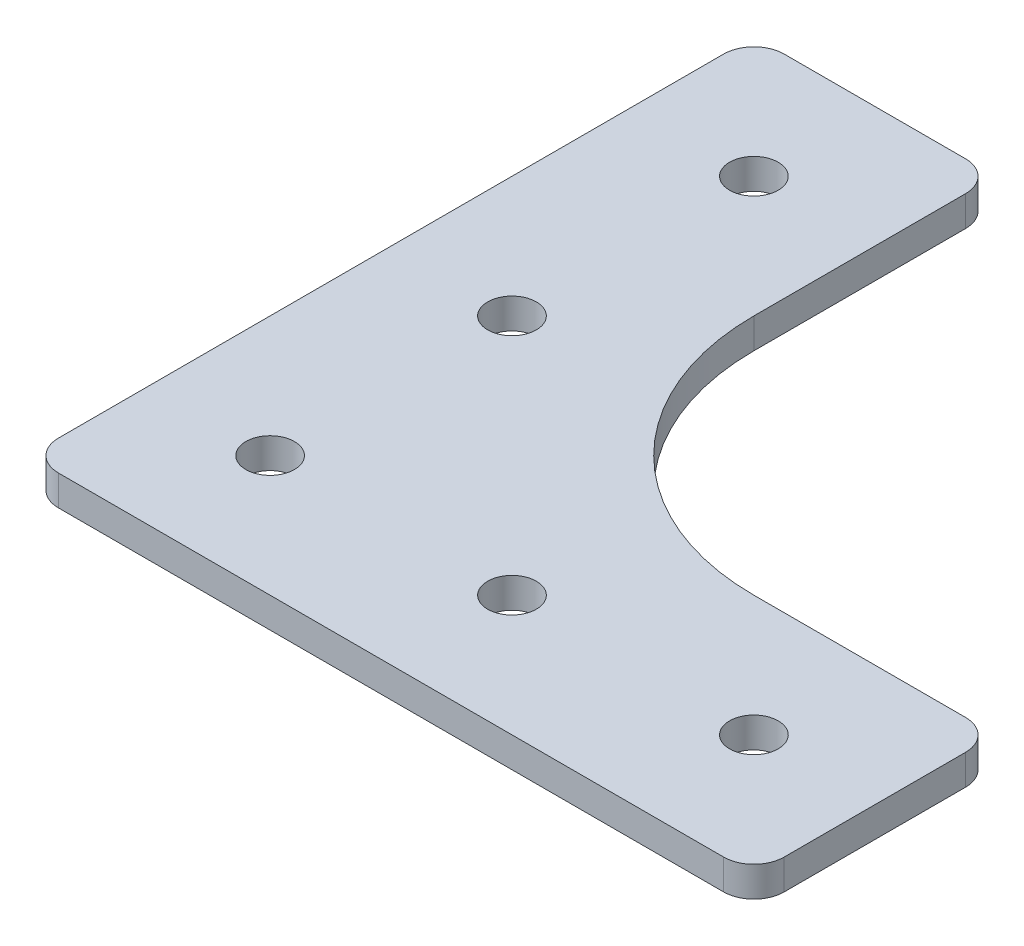
ISO-10303-21;
HEADER;
FILE_DESCRIPTION(('STEP AP214'),'2;1');
FILE_NAME('part.step','',(''),(''),'','','');
FILE_SCHEMA(('AUTOMOTIVE_DESIGN { 1 0 10303 214 1 1 1 1 }'));
ENDSEC;
DATA;
#1=APPLICATION_CONTEXT('core data for automotive mechanical design processes');
#2=APPLICATION_PROTOCOL_DEFINITION('international standard','automotive_design',2000,#1);
#3=PRODUCT_CONTEXT('',#1,'mechanical');
#4=PRODUCT('Part','Part','',(#3));
#5=PRODUCT_RELATED_PRODUCT_CATEGORY('part','',(#4));
#6=PRODUCT_DEFINITION_FORMATION('','',#4);
#7=PRODUCT_DEFINITION_CONTEXT('part definition',#1,'design');
#8=PRODUCT_DEFINITION('design','',#6,#7);
#9=PRODUCT_DEFINITION_SHAPE('','',#8);
#10=(LENGTH_UNIT() NAMED_UNIT(*) SI_UNIT(.MILLI.,.METRE.));
#11=(NAMED_UNIT(*) PLANE_ANGLE_UNIT() SI_UNIT($,.RADIAN.));
#12=(NAMED_UNIT(*) SI_UNIT($,.STERADIAN.) SOLID_ANGLE_UNIT());
#13=UNCERTAINTY_MEASURE_WITH_UNIT(LENGTH_MEASURE(1.E-05),#10,'distance_accuracy_value','');
#14=(GEOMETRIC_REPRESENTATION_CONTEXT(3) GLOBAL_UNCERTAINTY_ASSIGNED_CONTEXT((#13)) GLOBAL_UNIT_ASSIGNED_CONTEXT((#10,
#11,#12)) REPRESENTATION_CONTEXT('',''));
#15=CARTESIAN_POINT('',(0.,0.,0.));
#16=DIRECTION('',(0.,0.,1.));
#17=DIRECTION('',(1.,0.,0.));
#18=AXIS2_PLACEMENT_3D('',#15,#16,#17);
#19=CARTESIAN_POINT('',(50.8,3.175,-50.8));
#20=DIRECTION('',(0.,-1.,0.));
#21=DIRECTION('',(0.,0.,-1.));
#22=AXIS2_PLACEMENT_3D('',#19,#20,#21);
#23=PLANE('',#22);
#24=CARTESIAN_POINT('',(73.025,3.175,-22.225));
#25=DIRECTION('',(0.,-1.,0.));
#26=DIRECTION('',(0.,0.,-1.));
#27=AXIS2_PLACEMENT_3D('',#24,#25,#26);
#28=CIRCLE('',#27,3.175);
#29=CARTESIAN_POINT('',(73.025,3.175,-25.4));
#30=VERTEX_POINT('',#29);
#31=CARTESIAN_POINT('',(76.2,3.175,-22.225));
#32=VERTEX_POINT('',#31);
#33=EDGE_CURVE('E103',#30,#32,#28,.T.);
#34=ORIENTED_EDGE('',*,*,#33,.F.);
#35=DIRECTION('',(1.,0.,0.));
#36=VECTOR('',#35,1.);
#37=CARTESIAN_POINT('',(76.2,3.175,-25.4));
#38=LINE('',#37,#36);
#39=CARTESIAN_POINT('',(50.8000000000001,3.175,-25.4));
#40=VERTEX_POINT('',#39);
#41=EDGE_CURVE('E121',#30,#40,#38,.F.);
#42=ORIENTED_EDGE('',*,*,#41,.T.);
#43=CARTESIAN_POINT('',(50.8,3.175,-50.8));
#44=DIRECTION('',(0.,-1.,0.));
#45=DIRECTION('',(0.,0.,-1.));
#46=AXIS2_PLACEMENT_3D('',#43,#44,#45);
#47=CIRCLE('',#46,25.4);
#48=CARTESIAN_POINT('',(25.4,3.175,-50.8000000000001));
#49=VERTEX_POINT('',#48);
#50=EDGE_CURVE('E185',#40,#49,#47,.T.);
#51=ORIENTED_EDGE('',*,*,#50,.T.);
#52=DIRECTION('',(0.,0.,1.));
#53=VECTOR('',#52,1.);
#54=CARTESIAN_POINT('',(25.4,3.175,-50.8000000000002));
#55=LINE('',#54,#53);
#56=CARTESIAN_POINT('',(25.4,3.175,-73.025));
#57=VERTEX_POINT('',#56);
#58=EDGE_CURVE('E134',#49,#57,#55,.F.);
#59=ORIENTED_EDGE('',*,*,#58,.T.);
#60=CARTESIAN_POINT('',(22.225,3.175,-73.025));
#61=DIRECTION('',(0.,-1.,0.));
#62=DIRECTION('',(0.,0.,-1.));
#63=AXIS2_PLACEMENT_3D('',#60,#61,#62);
#64=CIRCLE('',#63,3.175);
#65=CARTESIAN_POINT('',(22.225,3.175,-76.2));
#66=VERTEX_POINT('',#65);
#67=EDGE_CURVE('E143',#66,#57,#64,.T.);
#68=ORIENTED_EDGE('',*,*,#67,.F.);
#69=DIRECTION('',(1.,0.,0.));
#70=VECTOR('',#69,1.);
#71=CARTESIAN_POINT('',(25.4,3.175,-76.2));
#72=LINE('',#71,#70);
#73=CARTESIAN_POINT('',(3.175,3.175,-76.2));
#74=VERTEX_POINT('',#73);
#75=EDGE_CURVE('E140',#66,#74,#72,.F.);
#76=ORIENTED_EDGE('',*,*,#75,.T.);
#77=CARTESIAN_POINT('',(3.175,3.175,-73.025));
#78=DIRECTION('',(0.,-1.,0.));
#79=DIRECTION('',(0.,0.,-1.));
#80=AXIS2_PLACEMENT_3D('',#77,#78,#79);
#81=CIRCLE('',#80,3.175);
#82=CARTESIAN_POINT('',(0.,3.175,-73.025));
#83=VERTEX_POINT('',#82);
#84=EDGE_CURVE('E190',#83,#74,#81,.T.);
#85=ORIENTED_EDGE('',*,*,#84,.F.);
#86=DIRECTION('',(0.,0.,-1.));
#87=VECTOR('',#86,1.);
#88=CARTESIAN_POINT('',(0.,3.175,-76.2));
#89=LINE('',#88,#87);
#90=CARTESIAN_POINT('',(0.,3.175,-3.17500000000001));
#91=VERTEX_POINT('',#90);
#92=EDGE_CURVE('E145',#83,#91,#89,.F.);
#93=ORIENTED_EDGE('',*,*,#92,.T.);
#94=CARTESIAN_POINT('',(3.175,3.175,-3.175));
#95=DIRECTION('',(0.,-1.,0.));
#96=DIRECTION('',(0.,0.,-1.));
#97=AXIS2_PLACEMENT_3D('',#94,#95,#96);
#98=CIRCLE('',#97,3.175);
#99=CARTESIAN_POINT('',(3.175,3.175,0.));
#100=VERTEX_POINT('',#99);
#101=EDGE_CURVE('E193',#100,#91,#98,.T.);
#102=ORIENTED_EDGE('',*,*,#101,.F.);
#103=DIRECTION('',(-1.,0.,0.));
#104=VECTOR('',#103,1.);
#105=CARTESIAN_POINT('',(0.,3.175,0.));
#106=LINE('',#105,#104);
#107=CARTESIAN_POINT('',(73.025,3.175,0.));
#108=VERTEX_POINT('',#107);
#109=EDGE_CURVE('E149',#100,#108,#106,.F.);
#110=ORIENTED_EDGE('',*,*,#109,.T.);
#111=CARTESIAN_POINT('',(73.025,3.175,-3.175));
#112=DIRECTION('',(0.,-1.,0.));
#113=DIRECTION('',(0.,0.,-1.));
#114=AXIS2_PLACEMENT_3D('',#111,#112,#113);
#115=CIRCLE('',#114,3.175);
#116=CARTESIAN_POINT('',(76.2,3.175,-3.175));
#117=VERTEX_POINT('',#116);
#118=EDGE_CURVE('E109',#117,#108,#115,.T.);
#119=ORIENTED_EDGE('',*,*,#118,.F.);
#120=DIRECTION('',(0.,0.,1.));
#121=VECTOR('',#120,1.);
#122=CARTESIAN_POINT('',(76.2,3.175,0.));
#123=LINE('',#122,#121);
#124=EDGE_CURVE('E106',#117,#32,#123,.F.);
#125=ORIENTED_EDGE('',*,*,#124,.T.);
#126=EDGE_LOOP('',(#34,#42,#51,#59,#68,#76,#85,#93,#102,#110,#119,#125));
#127=FACE_BOUND('',#126,.T.);
#128=CARTESIAN_POINT('',(63.5,3.175,-12.7));
#129=DIRECTION('',(0.,1.,0.));
#130=DIRECTION('',(0.,0.,1.));
#131=AXIS2_PLACEMENT_3D('',#128,#129,#130);
#132=CIRCLE('',#131,2.5527);
#133=CARTESIAN_POINT('',(63.5,3.175,-10.1473));
#134=VERTEX_POINT('',#133);
#135=EDGE_CURVE('E139',#134,#134,#132,.F.);
#136=ORIENTED_EDGE('',*,*,#135,.T.);
#137=EDGE_LOOP('',(#136));
#138=FACE_BOUND('',#137,.T.);
#139=CARTESIAN_POINT('',(38.1,3.175,-12.7));
#140=DIRECTION('',(0.,1.,0.));
#141=DIRECTION('',(0.,0.,1.));
#142=AXIS2_PLACEMENT_3D('',#139,#140,#141);
#143=CIRCLE('',#142,2.5527);
#144=CARTESIAN_POINT('',(38.1,3.175,-10.1473));
#145=VERTEX_POINT('',#144);
#146=EDGE_CURVE('E198',#145,#145,#143,.F.);
#147=ORIENTED_EDGE('',*,*,#146,.T.);
#148=EDGE_LOOP('',(#147));
#149=FACE_BOUND('',#148,.T.);
#150=CARTESIAN_POINT('',(12.7,3.175,-12.7));
#151=DIRECTION('',(0.,1.,0.));
#152=DIRECTION('',(0.,0.,1.));
#153=AXIS2_PLACEMENT_3D('',#150,#151,#152);
#154=CIRCLE('',#153,2.5527);
#155=CARTESIAN_POINT('',(12.7,3.175,-10.1473));
#156=VERTEX_POINT('',#155);
#157=EDGE_CURVE('E201',#156,#156,#154,.F.);
#158=ORIENTED_EDGE('',*,*,#157,.T.);
#159=EDGE_LOOP('',(#158));
#160=FACE_BOUND('',#159,.T.);
#161=CARTESIAN_POINT('',(12.7,3.175,-38.1));
#162=DIRECTION('',(0.,1.,0.));
#163=DIRECTION('',(0.,0.,1.));
#164=AXIS2_PLACEMENT_3D('',#161,#162,#163);
#165=CIRCLE('',#164,2.5527);
#166=CARTESIAN_POINT('',(12.7,3.175,-35.5473));
#167=VERTEX_POINT('',#166);
#168=EDGE_CURVE('E203',#167,#167,#165,.F.);
#169=ORIENTED_EDGE('',*,*,#168,.T.);
#170=EDGE_LOOP('',(#169));
#171=FACE_BOUND('',#170,.T.);
#172=CARTESIAN_POINT('',(12.7,3.175,-63.5));
#173=DIRECTION('',(0.,1.,0.));
#174=DIRECTION('',(0.,0.,1.));
#175=AXIS2_PLACEMENT_3D('',#172,#173,#174);
#176=CIRCLE('',#175,2.5527);
#177=CARTESIAN_POINT('',(12.7,3.175,-60.9473));
#178=VERTEX_POINT('',#177);
#179=EDGE_CURVE('E19',#178,#178,#176,.F.);
#180=ORIENTED_EDGE('',*,*,#179,.T.);
#181=EDGE_LOOP('',(#180));
#182=FACE_BOUND('',#181,.T.);
#183=ADVANCED_FACE('F16',(#127,#138,#149,#160,#171,#182),#23,.F.);
#184=CARTESIAN_POINT('',(12.7,0.,-63.5));
#185=DIRECTION('',(0.,1.,0.));
#186=DIRECTION('',(0.,0.,1.));
#187=AXIS2_PLACEMENT_3D('',#184,#185,#186);
#188=CYLINDRICAL_SURFACE('',#187,2.5527);
#189=ORIENTED_EDGE('',*,*,#179,.F.);
#190=EDGE_LOOP('',(#189));
#191=FACE_BOUND('',#190,.T.);
#192=CARTESIAN_POINT('',(12.7,0.,-63.5));
#193=DIRECTION('',(0.,1.,0.));
#194=DIRECTION('',(0.,0.,1.));
#195=AXIS2_PLACEMENT_3D('',#192,#193,#194);
#196=CIRCLE('',#195,2.5527);
#197=CARTESIAN_POINT('',(12.7,0.,-60.9473));
#198=VERTEX_POINT('',#197);
#199=EDGE_CURVE('E182',#198,#198,#196,.T.);
#200=ORIENTED_EDGE('',*,*,#199,.F.);
#201=EDGE_LOOP('',(#200));
#202=FACE_BOUND('',#201,.T.);
#203=ADVANCED_FACE('F211',(#191,#202),#188,.F.);
#204=CARTESIAN_POINT('',(12.7,0.,-38.1));
#205=DIRECTION('',(0.,1.,0.));
#206=DIRECTION('',(0.,0.,1.));
#207=AXIS2_PLACEMENT_3D('',#204,#205,#206);
#208=CYLINDRICAL_SURFACE('',#207,2.5527);
#209=ORIENTED_EDGE('',*,*,#168,.F.);
#210=EDGE_LOOP('',(#209));
#211=FACE_BOUND('',#210,.T.);
#212=CARTESIAN_POINT('',(12.7,0.,-38.1));
#213=DIRECTION('',(0.,1.,0.));
#214=DIRECTION('',(0.,0.,1.));
#215=AXIS2_PLACEMENT_3D('',#212,#213,#214);
#216=CIRCLE('',#215,2.5527);
#217=CARTESIAN_POINT('',(12.7,0.,-35.5473));
#218=VERTEX_POINT('',#217);
#219=EDGE_CURVE('E179',#218,#218,#216,.T.);
#220=ORIENTED_EDGE('',*,*,#219,.F.);
#221=EDGE_LOOP('',(#220));
#222=FACE_BOUND('',#221,.T.);
#223=ADVANCED_FACE('F214',(#211,#222),#208,.F.);
#224=CARTESIAN_POINT('',(12.7,0.,-12.7));
#225=DIRECTION('',(0.,1.,0.));
#226=DIRECTION('',(0.,0.,1.));
#227=AXIS2_PLACEMENT_3D('',#224,#225,#226);
#228=CYLINDRICAL_SURFACE('',#227,2.5527);
#229=ORIENTED_EDGE('',*,*,#157,.F.);
#230=EDGE_LOOP('',(#229));
#231=FACE_BOUND('',#230,.T.);
#232=CARTESIAN_POINT('',(12.7,0.,-12.7));
#233=DIRECTION('',(0.,1.,0.));
#234=DIRECTION('',(0.,0.,1.));
#235=AXIS2_PLACEMENT_3D('',#232,#233,#234);
#236=CIRCLE('',#235,2.5527);
#237=CARTESIAN_POINT('',(12.7,0.,-10.1473));
#238=VERTEX_POINT('',#237);
#239=EDGE_CURVE('E176',#238,#238,#236,.T.);
#240=ORIENTED_EDGE('',*,*,#239,.F.);
#241=EDGE_LOOP('',(#240));
#242=FACE_BOUND('',#241,.T.);
#243=ADVANCED_FACE('F277',(#231,#242),#228,.F.);
#244=CARTESIAN_POINT('',(38.1,0.,-12.7));
#245=DIRECTION('',(0.,1.,0.));
#246=DIRECTION('',(0.,0.,1.));
#247=AXIS2_PLACEMENT_3D('',#244,#245,#246);
#248=CYLINDRICAL_SURFACE('',#247,2.5527);
#249=ORIENTED_EDGE('',*,*,#146,.F.);
#250=EDGE_LOOP('',(#249));
#251=FACE_BOUND('',#250,.T.);
#252=CARTESIAN_POINT('',(38.1,0.,-12.7));
#253=DIRECTION('',(0.,1.,0.));
#254=DIRECTION('',(0.,0.,1.));
#255=AXIS2_PLACEMENT_3D('',#252,#253,#254);
#256=CIRCLE('',#255,2.5527);
#257=CARTESIAN_POINT('',(38.1,0.,-10.1473));
#258=VERTEX_POINT('',#257);
#259=EDGE_CURVE('E173',#258,#258,#256,.T.);
#260=ORIENTED_EDGE('',*,*,#259,.F.);
#261=EDGE_LOOP('',(#260));
#262=FACE_BOUND('',#261,.T.);
#263=ADVANCED_FACE('F273',(#251,#262),#248,.F.);
#264=CARTESIAN_POINT('',(63.5,0.,-12.7));
#265=DIRECTION('',(0.,1.,0.));
#266=DIRECTION('',(0.,0.,1.));
#267=AXIS2_PLACEMENT_3D('',#264,#265,#266);
#268=CYLINDRICAL_SURFACE('',#267,2.5527);
#269=ORIENTED_EDGE('',*,*,#135,.F.);
#270=EDGE_LOOP('',(#269));
#271=FACE_BOUND('',#270,.T.);
#272=CARTESIAN_POINT('',(63.5,0.,-12.7));
#273=DIRECTION('',(0.,1.,0.));
#274=DIRECTION('',(0.,0.,1.));
#275=AXIS2_PLACEMENT_3D('',#272,#273,#274);
#276=CIRCLE('',#275,2.5527);
#277=CARTESIAN_POINT('',(63.5,0.,-10.1473));
#278=VERTEX_POINT('',#277);
#279=EDGE_CURVE('E170',#278,#278,#276,.T.);
#280=ORIENTED_EDGE('',*,*,#279,.F.);
#281=EDGE_LOOP('',(#280));
#282=FACE_BOUND('',#281,.T.);
#283=ADVANCED_FACE('F269',(#271,#282),#268,.F.);
#284=CARTESIAN_POINT('',(76.2,3.175,-25.4));
#285=DIRECTION('',(0.,0.,1.));
#286=DIRECTION('',(1.,0.,0.));
#287=AXIS2_PLACEMENT_3D('',#284,#285,#286);
#288=PLANE('',#287);
#289=DIRECTION('',(0.,-1.,0.));
#290=VECTOR('',#289,1.);
#291=CARTESIAN_POINT('',(73.025,3.175,-25.4));
#292=LINE('',#291,#290);
#293=CARTESIAN_POINT('',(73.025,0.,-25.4));
#294=VERTEX_POINT('',#293);
#295=EDGE_CURVE('E114',#294,#30,#292,.F.);
#296=ORIENTED_EDGE('',*,*,#295,.F.);
#297=DIRECTION('',(1.,0.,0.));
#298=VECTOR('',#297,1.);
#299=CARTESIAN_POINT('',(50.8,0.,-25.4));
#300=LINE('',#299,#298);
#301=CARTESIAN_POINT('',(50.8000000000001,0.,-25.4));
#302=VERTEX_POINT('',#301);
#303=EDGE_CURVE('E169',#302,#294,#300,.T.);
#304=ORIENTED_EDGE('',*,*,#303,.F.);
#305=DIRECTION('',(0.,-1.,0.));
#306=VECTOR('',#305,1.);
#307=CARTESIAN_POINT('',(50.8000000000002,3.175,-25.4));
#308=LINE('',#307,#306);
#309=EDGE_CURVE('E187',#302,#40,#308,.F.);
#310=ORIENTED_EDGE('',*,*,#309,.T.);
#311=ORIENTED_EDGE('',*,*,#41,.F.);
#312=EDGE_LOOP('',(#296,#304,#310,#311));
#313=FACE_BOUND('',#312,.T.);
#314=ADVANCED_FACE('F266',(#313),#288,.F.);
#315=CARTESIAN_POINT('',(73.025,3.175,-22.225));
#316=DIRECTION('',(0.,-1.,0.));
#317=DIRECTION('',(0.,0.,-1.));
#318=AXIS2_PLACEMENT_3D('',#315,#316,#317);
#319=CYLINDRICAL_SURFACE('',#318,3.175);
#320=CARTESIAN_POINT('',(73.025,0.,-22.225));
#321=DIRECTION('',(0.,-1.,0.));
#322=DIRECTION('',(0.,0.,-1.));
#323=AXIS2_PLACEMENT_3D('',#320,#321,#322);
#324=CIRCLE('',#323,3.175);
#325=CARTESIAN_POINT('',(76.2,0.,-22.225));
#326=VERTEX_POINT('',#325);
#327=EDGE_CURVE('E167',#294,#326,#324,.T.);
#328=ORIENTED_EDGE('',*,*,#327,.F.);
#329=ORIENTED_EDGE('',*,*,#295,.T.);
#330=ORIENTED_EDGE('',*,*,#33,.T.);
#331=DIRECTION('',(0.,1.,0.));
#332=VECTOR('',#331,1.);
#333=CARTESIAN_POINT('',(76.2,3.175,-22.225));
#334=LINE('',#333,#332);
#335=EDGE_CURVE('E113',#32,#326,#334,.F.);
#336=ORIENTED_EDGE('',*,*,#335,.T.);
#337=EDGE_LOOP('',(#328,#329,#330,#336));
#338=FACE_BOUND('',#337,.T.);
#339=ADVANCED_FACE('F119',(#338),#319,.T.);
#340=CARTESIAN_POINT('',(76.2,3.175,0.));
#341=DIRECTION('',(-1.,0.,0.));
#342=DIRECTION('',(0.,0.,1.));
#343=AXIS2_PLACEMENT_3D('',#340,#341,#342);
#344=PLANE('',#343);
#345=ORIENTED_EDGE('',*,*,#335,.F.);
#346=ORIENTED_EDGE('',*,*,#124,.F.);
#347=DIRECTION('',(0.,-1.,0.));
#348=VECTOR('',#347,1.);
#349=CARTESIAN_POINT('',(76.2,3.175,-3.175));
#350=LINE('',#349,#348);
#351=CARTESIAN_POINT('',(76.2,0.,-3.175));
#352=VERTEX_POINT('',#351);
#353=EDGE_CURVE('E128',#352,#117,#350,.F.);
#354=ORIENTED_EDGE('',*,*,#353,.F.);
#355=DIRECTION('',(0.,0.,-1.));
#356=VECTOR('',#355,1.);
#357=CARTESIAN_POINT('',(76.2,0.,-50.8));
#358=LINE('',#357,#356);
#359=EDGE_CURVE('E125',#326,#352,#358,.F.);
#360=ORIENTED_EDGE('',*,*,#359,.F.);
#361=EDGE_LOOP('',(#345,#346,#354,#360));
#362=FACE_BOUND('',#361,.T.);
#363=ADVANCED_FACE('F123',(#362),#344,.F.);
#364=CARTESIAN_POINT('',(73.025,3.175,-3.175));
#365=DIRECTION('',(0.,-1.,0.));
#366=DIRECTION('',(0.,0.,-1.));
#367=AXIS2_PLACEMENT_3D('',#364,#365,#366);
#368=CYLINDRICAL_SURFACE('',#367,3.175);
#369=CARTESIAN_POINT('',(73.025,0.,-3.175));
#370=DIRECTION('',(0.,-1.,0.));
#371=DIRECTION('',(0.,0.,-1.));
#372=AXIS2_PLACEMENT_3D('',#369,#370,#371);
#373=CIRCLE('',#372,3.175);
#374=CARTESIAN_POINT('',(73.025,0.,0.));
#375=VERTEX_POINT('',#374);
#376=EDGE_CURVE('E164',#352,#375,#373,.T.);
#377=ORIENTED_EDGE('',*,*,#376,.F.);
#378=ORIENTED_EDGE('',*,*,#353,.T.);
#379=ORIENTED_EDGE('',*,*,#118,.T.);
#380=DIRECTION('',(0.,1.,0.));
#381=VECTOR('',#380,1.);
#382=CARTESIAN_POINT('',(73.025,3.175,0.));
#383=LINE('',#382,#381);
#384=EDGE_CURVE('E150',#108,#375,#383,.F.);
#385=ORIENTED_EDGE('',*,*,#384,.T.);
#386=EDGE_LOOP('',(#377,#378,#379,#385));
#387=FACE_BOUND('',#386,.T.);
#388=ADVANCED_FACE('F257',(#387),#368,.T.);
#389=CARTESIAN_POINT('',(0.,3.175,0.));
#390=DIRECTION('',(0.,0.,-1.));
#391=DIRECTION('',(-1.,0.,0.));
#392=AXIS2_PLACEMENT_3D('',#389,#390,#391);
#393=PLANE('',#392);
#394=ORIENTED_EDGE('',*,*,#384,.F.);
#395=ORIENTED_EDGE('',*,*,#109,.F.);
#396=DIRECTION('',(0.,-1.,0.));
#397=VECTOR('',#396,1.);
#398=CARTESIAN_POINT('',(3.175,3.175,0.));
#399=LINE('',#398,#397);
#400=CARTESIAN_POINT('',(3.175,0.,0.));
#401=VERTEX_POINT('',#400);
#402=EDGE_CURVE('E148',#401,#100,#399,.F.);
#403=ORIENTED_EDGE('',*,*,#402,.F.);
#404=DIRECTION('',(1.,0.,0.));
#405=VECTOR('',#404,1.);
#406=CARTESIAN_POINT('',(50.8,0.,0.));
#407=LINE('',#406,#405);
#408=EDGE_CURVE('E163',#375,#401,#407,.F.);
#409=ORIENTED_EDGE('',*,*,#408,.F.);
#410=EDGE_LOOP('',(#394,#395,#403,#409));
#411=FACE_BOUND('',#410,.T.);
#412=ADVANCED_FACE('F253',(#411),#393,.F.);
#413=CARTESIAN_POINT('',(3.175,3.175,-3.175));
#414=DIRECTION('',(0.,-1.,0.));
#415=DIRECTION('',(0.,0.,-1.));
#416=AXIS2_PLACEMENT_3D('',#413,#414,#415);
#417=CYLINDRICAL_SURFACE('',#416,3.175);
#418=CARTESIAN_POINT('',(3.175,0.,-3.175));
#419=DIRECTION('',(0.,-1.,0.));
#420=DIRECTION('',(0.,0.,-1.));
#421=AXIS2_PLACEMENT_3D('',#418,#419,#420);
#422=CIRCLE('',#421,3.175);
#423=CARTESIAN_POINT('',(0.,0.,-3.17500000000001));
#424=VERTEX_POINT('',#423);
#425=EDGE_CURVE('E160',#401,#424,#422,.T.);
#426=ORIENTED_EDGE('',*,*,#425,.F.);
#427=ORIENTED_EDGE('',*,*,#402,.T.);
#428=ORIENTED_EDGE('',*,*,#101,.T.);
#429=DIRECTION('',(0.,1.,0.));
#430=VECTOR('',#429,1.);
#431=CARTESIAN_POINT('',(0.,3.175,-3.17500000000003));
#432=LINE('',#431,#430);
#433=EDGE_CURVE('E147',#91,#424,#432,.F.);
#434=ORIENTED_EDGE('',*,*,#433,.T.);
#435=EDGE_LOOP('',(#426,#427,#428,#434));
#436=FACE_BOUND('',#435,.T.);
#437=ADVANCED_FACE('F249',(#436),#417,.T.);
#438=CARTESIAN_POINT('',(0.,3.175,-76.2));
#439=DIRECTION('',(1.,0.,0.));
#440=DIRECTION('',(0.,0.,-1.));
#441=AXIS2_PLACEMENT_3D('',#438,#439,#440);
#442=PLANE('',#441);
#443=ORIENTED_EDGE('',*,*,#433,.F.);
#444=ORIENTED_EDGE('',*,*,#92,.F.);
#445=DIRECTION('',(0.,-1.,0.));
#446=VECTOR('',#445,1.);
#447=CARTESIAN_POINT('',(0.,3.175,-73.025));
#448=LINE('',#447,#446);
#449=CARTESIAN_POINT('',(0.,0.,-73.025));
#450=VERTEX_POINT('',#449);
#451=EDGE_CURVE('E192',#450,#83,#448,.F.);
#452=ORIENTED_EDGE('',*,*,#451,.F.);
#453=DIRECTION('',(0.,0.,-1.));
#454=VECTOR('',#453,1.);
#455=CARTESIAN_POINT('',(0.,0.,-50.8));
#456=LINE('',#455,#454);
#457=EDGE_CURVE('E159',#424,#450,#456,.T.);
#458=ORIENTED_EDGE('',*,*,#457,.F.);
#459=EDGE_LOOP('',(#443,#444,#452,#458));
#460=FACE_BOUND('',#459,.T.);
#461=ADVANCED_FACE('F245',(#460),#442,.F.);
#462=CARTESIAN_POINT('',(3.175,3.175,-73.025));
#463=DIRECTION('',(0.,-1.,0.));
#464=DIRECTION('',(0.,0.,-1.));
#465=AXIS2_PLACEMENT_3D('',#462,#463,#464);
#466=CYLINDRICAL_SURFACE('',#465,3.175);
#467=CARTESIAN_POINT('',(3.175,0.,-73.025));
#468=DIRECTION('',(0.,-1.,0.));
#469=DIRECTION('',(0.,0.,-1.));
#470=AXIS2_PLACEMENT_3D('',#467,#468,#469);
#471=CIRCLE('',#470,3.175);
#472=CARTESIAN_POINT('',(3.175,0.,-76.2));
#473=VERTEX_POINT('',#472);
#474=EDGE_CURVE('E156',#450,#473,#471,.T.);
#475=ORIENTED_EDGE('',*,*,#474,.F.);
#476=ORIENTED_EDGE('',*,*,#451,.T.);
#477=ORIENTED_EDGE('',*,*,#84,.T.);
#478=DIRECTION('',(0.,1.,0.));
#479=VECTOR('',#478,1.);
#480=CARTESIAN_POINT('',(3.175,3.175,-76.2));
#481=LINE('',#480,#479);
#482=EDGE_CURVE('E144',#74,#473,#481,.F.);
#483=ORIENTED_EDGE('',*,*,#482,.T.);
#484=EDGE_LOOP('',(#475,#476,#477,#483));
#485=FACE_BOUND('',#484,.T.);
#486=ADVANCED_FACE('F241',(#485),#466,.T.);
#487=CARTESIAN_POINT('',(25.4,3.175,-76.2));
#488=DIRECTION('',(0.,0.,1.));
#489=DIRECTION('',(1.,0.,0.));
#490=AXIS2_PLACEMENT_3D('',#487,#488,#489);
#491=PLANE('',#490);
#492=DIRECTION('',(0.,-1.,0.));
#493=VECTOR('',#492,1.);
#494=CARTESIAN_POINT('',(22.225,3.175,-76.2));
#495=LINE('',#494,#493);
#496=CARTESIAN_POINT('',(22.225,0.,-76.2));
#497=VERTEX_POINT('',#496);
#498=EDGE_CURVE('E137',#497,#66,#495,.F.);
#499=ORIENTED_EDGE('',*,*,#498,.F.);
#500=DIRECTION('',(1.,0.,0.));
#501=VECTOR('',#500,1.);
#502=CARTESIAN_POINT('',(50.8,0.,-76.2));
#503=LINE('',#502,#501);
#504=EDGE_CURVE('E155',#473,#497,#503,.T.);
#505=ORIENTED_EDGE('',*,*,#504,.F.);
#506=ORIENTED_EDGE('',*,*,#482,.F.);
#507=ORIENTED_EDGE('',*,*,#75,.F.);
#508=EDGE_LOOP('',(#499,#505,#506,#507));
#509=FACE_BOUND('',#508,.T.);
#510=ADVANCED_FACE('F237',(#509),#491,.F.);
#511=CARTESIAN_POINT('',(22.225,3.175,-73.025));
#512=DIRECTION('',(0.,-1.,0.));
#513=DIRECTION('',(0.,0.,-1.));
#514=AXIS2_PLACEMENT_3D('',#511,#512,#513);
#515=CYLINDRICAL_SURFACE('',#514,3.175);
#516=CARTESIAN_POINT('',(22.225,0.,-73.025));
#517=DIRECTION('',(0.,-1.,0.));
#518=DIRECTION('',(0.,0.,-1.));
#519=AXIS2_PLACEMENT_3D('',#516,#517,#518);
#520=CIRCLE('',#519,3.175);
#521=CARTESIAN_POINT('',(25.4,0.,-73.025));
#522=VERTEX_POINT('',#521);
#523=EDGE_CURVE('E152',#497,#522,#520,.T.);
#524=ORIENTED_EDGE('',*,*,#523,.F.);
#525=ORIENTED_EDGE('',*,*,#498,.T.);
#526=ORIENTED_EDGE('',*,*,#67,.T.);
#527=DIRECTION('',(0.,1.,0.));
#528=VECTOR('',#527,1.);
#529=CARTESIAN_POINT('',(25.4,3.175,-73.025));
#530=LINE('',#529,#528);
#531=EDGE_CURVE('E136',#57,#522,#530,.F.);
#532=ORIENTED_EDGE('',*,*,#531,.T.);
#533=EDGE_LOOP('',(#524,#525,#526,#532));
#534=FACE_BOUND('',#533,.T.);
#535=ADVANCED_FACE('F234',(#534),#515,.T.);
#536=CARTESIAN_POINT('',(25.4,3.175,-50.8000000000002));
#537=DIRECTION('',(-1.,0.,0.));
#538=DIRECTION('',(0.,0.,1.));
#539=AXIS2_PLACEMENT_3D('',#536,#537,#538);
#540=PLANE('',#539);
#541=ORIENTED_EDGE('',*,*,#531,.F.);
#542=ORIENTED_EDGE('',*,*,#58,.F.);
#543=DIRECTION('',(0.,-1.,0.));
#544=VECTOR('',#543,1.);
#545=CARTESIAN_POINT('',(25.4,3.175,-50.8000000000002));
#546=LINE('',#545,#544);
#547=CARTESIAN_POINT('',(25.4,0.,-50.8000000000001));
#548=VERTEX_POINT('',#547);
#549=EDGE_CURVE('E34',#49,#548,#546,.T.);
#550=ORIENTED_EDGE('',*,*,#549,.T.);
#551=DIRECTION('',(0.,0.,-1.));
#552=VECTOR('',#551,1.);
#553=CARTESIAN_POINT('',(25.4,0.,-50.8));
#554=LINE('',#553,#552);
#555=EDGE_CURVE('E25',#522,#548,#554,.F.);
#556=ORIENTED_EDGE('',*,*,#555,.F.);
#557=EDGE_LOOP('',(#541,#542,#550,#556));
#558=FACE_BOUND('',#557,.T.);
#559=ADVANCED_FACE('F226',(#558),#540,.F.);
#560=CARTESIAN_POINT('',(50.8,3.175,-50.8));
#561=DIRECTION('',(0.,-1.,0.));
#562=DIRECTION('',(0.,0.,-1.));
#563=AXIS2_PLACEMENT_3D('',#560,#561,#562);
#564=CYLINDRICAL_SURFACE('',#563,25.4);
#565=ORIENTED_EDGE('',*,*,#549,.F.);
#566=ORIENTED_EDGE('',*,*,#50,.F.);
#567=ORIENTED_EDGE('',*,*,#309,.F.);
#568=CARTESIAN_POINT('',(50.8,0.,-50.8));
#569=DIRECTION('',(0.,-1.,0.));
#570=DIRECTION('',(0.,0.,-1.));
#571=AXIS2_PLACEMENT_3D('',#568,#569,#570);
#572=CIRCLE('',#571,25.4);
#573=EDGE_CURVE('E11',#548,#302,#572,.F.);
#574=ORIENTED_EDGE('',*,*,#573,.F.);
#575=EDGE_LOOP('',(#565,#566,#567,#574));
#576=FACE_BOUND('',#575,.T.);
#577=ADVANCED_FACE('F219',(#576),#564,.F.);
#578=CARTESIAN_POINT('',(50.8,0.,-50.8));
#579=DIRECTION('',(0.,-1.,0.));
#580=DIRECTION('',(0.,0.,-1.));
#581=AXIS2_PLACEMENT_3D('',#578,#579,#580);
#582=PLANE('',#581);
#583=ORIENTED_EDGE('',*,*,#555,.T.);
#584=ORIENTED_EDGE('',*,*,#573,.T.);
#585=ORIENTED_EDGE('',*,*,#303,.T.);
#586=ORIENTED_EDGE('',*,*,#327,.T.);
#587=ORIENTED_EDGE('',*,*,#359,.T.);
#588=ORIENTED_EDGE('',*,*,#376,.T.);
#589=ORIENTED_EDGE('',*,*,#408,.T.);
#590=ORIENTED_EDGE('',*,*,#425,.T.);
#591=ORIENTED_EDGE('',*,*,#457,.T.);
#592=ORIENTED_EDGE('',*,*,#474,.T.);
#593=ORIENTED_EDGE('',*,*,#504,.T.);
#594=ORIENTED_EDGE('',*,*,#523,.T.);
#595=EDGE_LOOP('',(#583,#584,#585,#586,#587,#588,#589,#590,#591,#592,#593,#594));
#596=FACE_BOUND('',#595,.T.);
#597=ORIENTED_EDGE('',*,*,#279,.T.);
#598=EDGE_LOOP('',(#597));
#599=FACE_BOUND('',#598,.T.);
#600=ORIENTED_EDGE('',*,*,#259,.T.);
#601=EDGE_LOOP('',(#600));
#602=FACE_BOUND('',#601,.T.);
#603=ORIENTED_EDGE('',*,*,#239,.T.);
#604=EDGE_LOOP('',(#603));
#605=FACE_BOUND('',#604,.T.);
#606=ORIENTED_EDGE('',*,*,#219,.T.);
#607=EDGE_LOOP('',(#606));
#608=FACE_BOUND('',#607,.T.);
#609=ORIENTED_EDGE('',*,*,#199,.T.);
#610=EDGE_LOOP('',(#609));
#611=FACE_BOUND('',#610,.T.);
#612=ADVANCED_FACE('F217',(#596,#599,#602,#605,#608,#611),#582,.T.);
#613=CLOSED_SHELL('',(#183,#203,#223,#243,#263,#283,#314,#339,#363,#388,#412,#437,#461,#486,
#510,#535,#559,#577,#612));
#614=MANIFOLD_SOLID_BREP('B1',#613);
#615=ADVANCED_BREP_SHAPE_REPRESENTATION('',(#18,#614),#14);
#616=SHAPE_DEFINITION_REPRESENTATION(#9,#615);
ENDSEC;
END-ISO-10303-21;
